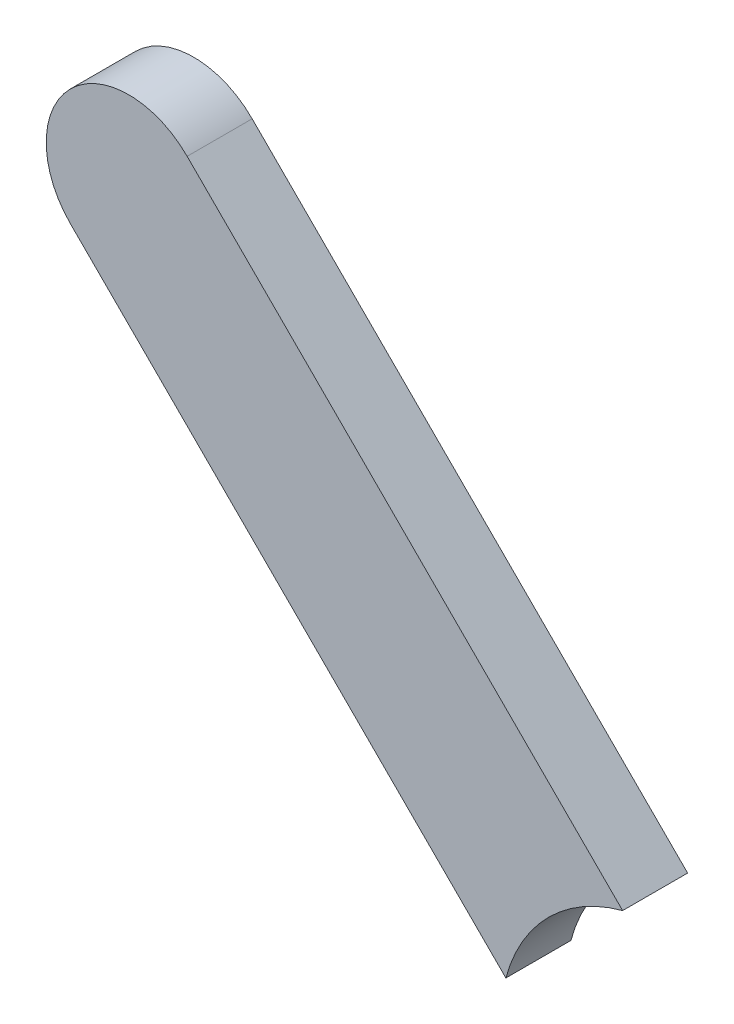
ISO-10303-21;
HEADER;
FILE_DESCRIPTION(('STEP AP214'),'2;1');
FILE_NAME('part.step','',(''),(''),'','','');
FILE_SCHEMA(('AUTOMOTIVE_DESIGN { 1 0 10303 214 1 1 1 1 }'));
ENDSEC;
DATA;
#1=APPLICATION_CONTEXT('core data for automotive mechanical design processes');
#2=APPLICATION_PROTOCOL_DEFINITION('international standard','automotive_design',2000,#1);
#3=PRODUCT_CONTEXT('',#1,'mechanical');
#4=PRODUCT('Part','Part','',(#3));
#5=PRODUCT_RELATED_PRODUCT_CATEGORY('part','',(#4));
#6=PRODUCT_DEFINITION_FORMATION('','',#4);
#7=PRODUCT_DEFINITION_CONTEXT('part definition',#1,'design');
#8=PRODUCT_DEFINITION('design','',#6,#7);
#9=PRODUCT_DEFINITION_SHAPE('','',#8);
#10=(LENGTH_UNIT() NAMED_UNIT(*) SI_UNIT(.MILLI.,.METRE.));
#11=(NAMED_UNIT(*) PLANE_ANGLE_UNIT() SI_UNIT($,.RADIAN.));
#12=(NAMED_UNIT(*) SI_UNIT($,.STERADIAN.) SOLID_ANGLE_UNIT());
#13=UNCERTAINTY_MEASURE_WITH_UNIT(LENGTH_MEASURE(1.E-05),#10,'distance_accuracy_value','');
#14=(GEOMETRIC_REPRESENTATION_CONTEXT(3) GLOBAL_UNCERTAINTY_ASSIGNED_CONTEXT((#13)) GLOBAL_UNIT_ASSIGNED_CONTEXT((#10,
#11,#12)) REPRESENTATION_CONTEXT('',''));
#15=CARTESIAN_POINT('',(0.,0.,0.));
#16=DIRECTION('',(0.,0.,1.));
#17=DIRECTION('',(1.,0.,0.));
#18=AXIS2_PLACEMENT_3D('',#15,#16,#17);
#19=CARTESIAN_POINT('',(150.9503966,91.89539406,0.));
#20=DIRECTION('',(0.707106781186551,0.707106781186544,0.));
#21=DIRECTION('',(0.707106781186544,-0.707106781186551,0.));
#22=AXIS2_PLACEMENT_3D('',#19,#20,#21);
#23=PLANE('',#22);
#24=DIRECTION('',(0.707106781186544,-0.707106781186551,0.));
#25=VECTOR('',#24,1.);
#26=CARTESIAN_POINT('',(150.9503966,91.89539406,0.1999996));
#27=LINE('',#26,#25);
#28=CARTESIAN_POINT('',(150.9503966,91.89539406,0.1999996));
#29=VERTEX_POINT('',#28);
#30=CARTESIAN_POINT('',(152.290309871461,90.5554807885386,0.1999996));
#31=VERTEX_POINT('',#30);
#32=EDGE_CURVE('E11',#29,#31,#27,.T.);
#33=ORIENTED_EDGE('',*,*,#32,.F.);
#34=DIRECTION('',(0.,0.,1.));
#35=VECTOR('',#34,1.);
#36=CARTESIAN_POINT('',(150.9503966,91.89539406,0.));
#37=LINE('',#36,#35);
#38=CARTESIAN_POINT('',(150.9503966,91.89539406,0.));
#39=VERTEX_POINT('',#38);
#40=EDGE_CURVE('E24',#39,#29,#37,.T.);
#41=ORIENTED_EDGE('',*,*,#40,.F.);
#42=DIRECTION('',(0.707106781186544,-0.707106781186551,0.));
#43=VECTOR('',#42,1.);
#44=CARTESIAN_POINT('',(150.9503966,91.89539406,0.));
#45=LINE('',#44,#43);
#46=CARTESIAN_POINT('',(152.290309871461,90.5554807885386,0.));
#47=VERTEX_POINT('',#46);
#48=EDGE_CURVE('E75',#39,#47,#45,.T.);
#49=ORIENTED_EDGE('',*,*,#48,.T.);
#50=DIRECTION('',(0.,0.,1.));
#51=VECTOR('',#50,1.);
#52=CARTESIAN_POINT('',(152.290309871461,90.5554807885386,0.));
#53=LINE('',#52,#51);
#54=EDGE_CURVE('E37',#47,#31,#53,.T.);
#55=ORIENTED_EDGE('',*,*,#54,.T.);
#56=EDGE_LOOP('',(#33,#41,#49,#55));
#57=FACE_BOUND('',#56,.T.);
#58=ADVANCED_FACE('F17',(#57),#23,.F.);
#59=CARTESIAN_POINT('',(152.781,90.424,0.));
#60=DIRECTION('',(0.,0.,-1.));
#61=DIRECTION('',(1.,0.,0.));
#62=AXIS2_PLACEMENT_3D('',#59,#60,#61);
#63=CYLINDRICAL_SURFACE('',#62,0.508);
#64=DIRECTION('',(0.,0.,1.));
#65=VECTOR('',#64,1.);
#66=CARTESIAN_POINT('',(152.649519211461,90.9146901285386,0.));
#67=LINE('',#66,#65);
#68=CARTESIAN_POINT('',(152.649519211461,90.9146901285386,0.));
#69=VERTEX_POINT('',#68);
#70=CARTESIAN_POINT('',(152.649519211461,90.9146901285386,0.1999996));
#71=VERTEX_POINT('',#70);
#72=EDGE_CURVE('E67',#69,#71,#67,.T.);
#73=ORIENTED_EDGE('',*,*,#72,.T.);
#74=CARTESIAN_POINT('',(152.781,90.424,0.1999996));
#75=DIRECTION('',(0.,0.,1.));
#76=DIRECTION('',(1.,0.,0.));
#77=AXIS2_PLACEMENT_3D('',#74,#75,#76);
#78=CIRCLE('',#77,0.508);
#79=EDGE_CURVE('E82',#71,#31,#78,.T.);
#80=ORIENTED_EDGE('',*,*,#79,.T.);
#81=ORIENTED_EDGE('',*,*,#54,.F.);
#82=CARTESIAN_POINT('',(152.781,90.424,0.));
#83=DIRECTION('',(0.,0.,1.));
#84=DIRECTION('',(1.,0.,0.));
#85=AXIS2_PLACEMENT_3D('',#82,#83,#84);
#86=CIRCLE('',#85,0.508);
#87=EDGE_CURVE('E80',#69,#47,#86,.T.);
#88=ORIENTED_EDGE('',*,*,#87,.F.);
#89=EDGE_LOOP('',(#73,#80,#81,#88));
#90=FACE_BOUND('',#89,.T.);
#91=ADVANCED_FACE('F88',(#90),#63,.F.);
#92=CARTESIAN_POINT('',(152.649519211461,90.9146901285386,0.));
#93=DIRECTION('',(-0.707106781186545,-0.707106781186551,0.));
#94=DIRECTION('',(-0.707106781186551,0.707106781186545,0.));
#95=AXIS2_PLACEMENT_3D('',#92,#93,#94);
#96=PLANE('',#95);
#97=DIRECTION('',(-0.707106781186551,0.707106781186545,0.));
#98=VECTOR('',#97,1.);
#99=CARTESIAN_POINT('',(152.9606034,90.60360594,0.1999996));
#100=LINE('',#99,#98);
#101=CARTESIAN_POINT('',(151.30960594,92.2546034,0.1999996));
#102=VERTEX_POINT('',#101);
#103=EDGE_CURVE('E71',#71,#102,#100,.T.);
#104=ORIENTED_EDGE('',*,*,#103,.F.);
#105=ORIENTED_EDGE('',*,*,#72,.F.);
#106=DIRECTION('',(-0.707106781186551,0.707106781186545,0.));
#107=VECTOR('',#106,1.);
#108=CARTESIAN_POINT('',(152.9606034,90.60360594,0.));
#109=LINE('',#108,#107);
#110=CARTESIAN_POINT('',(151.30960594,92.2546034,0.));
#111=VERTEX_POINT('',#110);
#112=EDGE_CURVE('E63',#69,#111,#109,.T.);
#113=ORIENTED_EDGE('',*,*,#112,.T.);
#114=DIRECTION('',(0.,0.,1.));
#115=VECTOR('',#114,1.);
#116=CARTESIAN_POINT('',(151.30960594,92.2546034,0.));
#117=LINE('',#116,#115);
#118=EDGE_CURVE('E53',#111,#102,#117,.T.);
#119=ORIENTED_EDGE('',*,*,#118,.T.);
#120=EDGE_LOOP('',(#104,#105,#113,#119));
#121=FACE_BOUND('',#120,.T.);
#122=ADVANCED_FACE('F66',(#121),#96,.F.);
#123=CARTESIAN_POINT('',(151.13000127,92.07499873,0.));
#124=DIRECTION('',(0.,0.,-1.));
#125=DIRECTION('',(0.707106781186576,0.70710678118652,0.));
#126=AXIS2_PLACEMENT_3D('',#123,#124,#125);
#127=CYLINDRICAL_SURFACE('',#126,0.253999360179529);
#128=CARTESIAN_POINT('',(151.13000127,92.07499873,0.1999996));
#129=DIRECTION('',(0.,0.,1.));
#130=DIRECTION('',(0.707106781186576,0.70710678118652,0.));
#131=AXIS2_PLACEMENT_3D('',#128,#129,#130);
#132=CIRCLE('',#131,0.253999360179529);
#133=EDGE_CURVE('E59',#102,#29,#132,.T.);
#134=ORIENTED_EDGE('',*,*,#133,.F.);
#135=ORIENTED_EDGE('',*,*,#118,.F.);
#136=CARTESIAN_POINT('',(151.13000127,92.07499873,0.));
#137=DIRECTION('',(0.,0.,1.));
#138=DIRECTION('',(0.707106781186576,0.70710678118652,0.));
#139=AXIS2_PLACEMENT_3D('',#136,#137,#138);
#140=CIRCLE('',#139,0.253999360179529);
#141=EDGE_CURVE('E57',#111,#39,#140,.T.);
#142=ORIENTED_EDGE('',*,*,#141,.T.);
#143=ORIENTED_EDGE('',*,*,#40,.T.);
#144=EDGE_LOOP('',(#134,#135,#142,#143));
#145=FACE_BOUND('',#144,.T.);
#146=ADVANCED_FACE('F55',(#145),#127,.T.);
#147=CARTESIAN_POINT('',(150.9503966,91.89539406,0.));
#148=DIRECTION('',(0.,0.,-1.));
#149=DIRECTION('',(-1.,0.,0.));
#150=AXIS2_PLACEMENT_3D('',#147,#148,#149);
#151=PLANE('',#150);
#152=ORIENTED_EDGE('',*,*,#48,.F.);
#153=ORIENTED_EDGE('',*,*,#141,.F.);
#154=ORIENTED_EDGE('',*,*,#112,.F.);
#155=ORIENTED_EDGE('',*,*,#87,.T.);
#156=EDGE_LOOP('',(#152,#153,#154,#155));
#157=FACE_BOUND('',#156,.T.);
#158=ADVANCED_FACE('F74',(#157),#151,.T.);
#159=CARTESIAN_POINT('',(150.9503966,91.89539406,0.1999996));
#160=DIRECTION('',(0.,0.,-1.));
#161=DIRECTION('',(-1.,0.,0.));
#162=AXIS2_PLACEMENT_3D('',#159,#160,#161);
#163=PLANE('',#162);
#164=ORIENTED_EDGE('',*,*,#133,.T.);
#165=ORIENTED_EDGE('',*,*,#32,.T.);
#166=ORIENTED_EDGE('',*,*,#79,.F.);
#167=ORIENTED_EDGE('',*,*,#103,.T.);
#168=EDGE_LOOP('',(#164,#165,#166,#167));
#169=FACE_BOUND('',#168,.T.);
#170=ADVANCED_FACE('F91',(#169),#163,.F.);
#171=CLOSED_SHELL('',(#58,#91,#122,#146,#158,#170));
#172=MANIFOLD_SOLID_BREP('B1',#171);
#173=ADVANCED_BREP_SHAPE_REPRESENTATION('',(#18,#172),#14);
#174=SHAPE_DEFINITION_REPRESENTATION(#9,#173);
ENDSEC;
END-ISO-10303-21;
